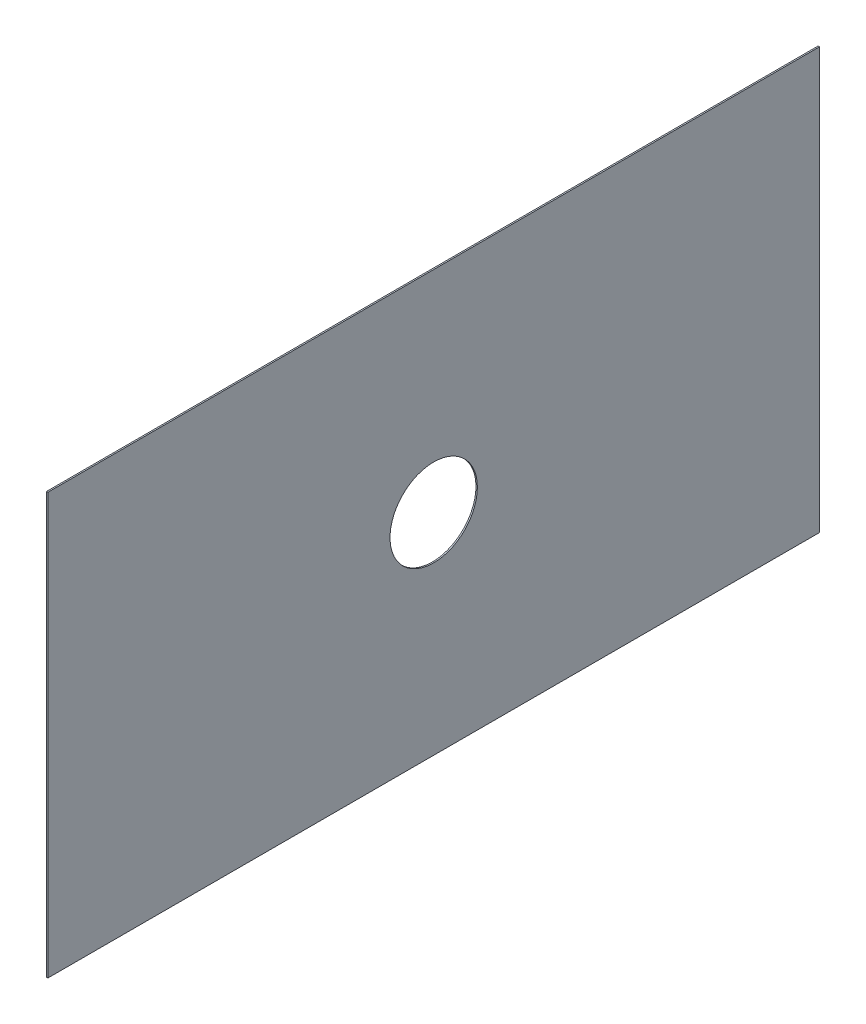
ISO-10303-21;
HEADER;
FILE_DESCRIPTION(('STEP AP214'),'2;1');
FILE_NAME('part.step','',(''),(''),'','','');
FILE_SCHEMA(('AUTOMOTIVE_DESIGN { 1 0 10303 214 1 1 1 1 }'));
ENDSEC;
DATA;
#1=APPLICATION_CONTEXT('core data for automotive mechanical design processes');
#2=APPLICATION_PROTOCOL_DEFINITION('international standard','automotive_design',2000,#1);
#3=PRODUCT_CONTEXT('',#1,'mechanical');
#4=PRODUCT('Part','Part','',(#3));
#5=PRODUCT_RELATED_PRODUCT_CATEGORY('part','',(#4));
#6=PRODUCT_DEFINITION_FORMATION('','',#4);
#7=PRODUCT_DEFINITION_CONTEXT('part definition',#1,'design');
#8=PRODUCT_DEFINITION('design','',#6,#7);
#9=PRODUCT_DEFINITION_SHAPE('','',#8);
#10=(LENGTH_UNIT() NAMED_UNIT(*) SI_UNIT(.MILLI.,.METRE.));
#11=(NAMED_UNIT(*) PLANE_ANGLE_UNIT() SI_UNIT($,.RADIAN.));
#12=(NAMED_UNIT(*) SI_UNIT($,.STERADIAN.) SOLID_ANGLE_UNIT());
#13=UNCERTAINTY_MEASURE_WITH_UNIT(LENGTH_MEASURE(1.E-05),#10,'distance_accuracy_value','');
#14=(GEOMETRIC_REPRESENTATION_CONTEXT(3) GLOBAL_UNCERTAINTY_ASSIGNED_CONTEXT((#13)) GLOBAL_UNIT_ASSIGNED_CONTEXT((#10,
#11,#12)) REPRESENTATION_CONTEXT('',''));
#15=CARTESIAN_POINT('',(0.,0.,0.));
#16=DIRECTION('',(0.,0.,1.));
#17=DIRECTION('',(1.,0.,0.));
#18=AXIS2_PLACEMENT_3D('',#15,#16,#17);
#19=CARTESIAN_POINT('',(2.,-301.,552.));
#20=DIRECTION('',(0.,0.,-1.));
#21=DIRECTION('',(-1.,0.,0.));
#22=AXIS2_PLACEMENT_3D('',#19,#20,#21);
#23=PLANE('',#22);
#24=DIRECTION('',(0.,-1.,0.));
#25=VECTOR('',#24,1.);
#26=CARTESIAN_POINT('',(0.,-301.,552.));
#27=LINE('',#26,#25);
#28=CARTESIAN_POINT('',(0.,301.,552.));
#29=VERTEX_POINT('',#28);
#30=CARTESIAN_POINT('',(0.,-301.,552.));
#31=VERTEX_POINT('',#30);
#32=EDGE_CURVE('E94',#29,#31,#27,.T.);
#33=ORIENTED_EDGE('',*,*,#32,.T.);
#34=DIRECTION('',(-1.,0.,0.));
#35=VECTOR('',#34,1.);
#36=CARTESIAN_POINT('',(2.,-301.,552.));
#37=LINE('',#36,#35);
#38=CARTESIAN_POINT('',(2.,-301.,552.));
#39=VERTEX_POINT('',#38);
#40=EDGE_CURVE('E11',#39,#31,#37,.T.);
#41=ORIENTED_EDGE('',*,*,#40,.F.);
#42=DIRECTION('',(0.,-1.,0.));
#43=VECTOR('',#42,1.);
#44=CARTESIAN_POINT('',(2.,-301.,552.));
#45=LINE('',#44,#43);
#46=CARTESIAN_POINT('',(2.,301.,552.));
#47=VERTEX_POINT('',#46);
#48=EDGE_CURVE('E82',#47,#39,#45,.T.);
#49=ORIENTED_EDGE('',*,*,#48,.F.);
#50=DIRECTION('',(-1.,0.,0.));
#51=VECTOR('',#50,1.);
#52=CARTESIAN_POINT('',(2.,301.,552.));
#53=LINE('',#52,#51);
#54=EDGE_CURVE('E90',#47,#29,#53,.T.);
#55=ORIENTED_EDGE('',*,*,#54,.T.);
#56=EDGE_LOOP('',(#33,#41,#49,#55));
#57=FACE_BOUND('',#56,.T.);
#58=ADVANCED_FACE('F31',(#57),#23,.F.);
#59=CARTESIAN_POINT('',(2.,-301.,-552.));
#60=DIRECTION('',(0.,1.,0.));
#61=DIRECTION('',(0.,0.,1.));
#62=AXIS2_PLACEMENT_3D('',#59,#60,#61);
#63=PLANE('',#62);
#64=DIRECTION('',(0.,0.,-1.));
#65=VECTOR('',#64,1.);
#66=CARTESIAN_POINT('',(0.,-301.,-552.));
#67=LINE('',#66,#65);
#68=CARTESIAN_POINT('',(0.,-301.,-552.));
#69=VERTEX_POINT('',#68);
#70=EDGE_CURVE('E86',#31,#69,#67,.T.);
#71=ORIENTED_EDGE('',*,*,#70,.T.);
#72=DIRECTION('',(-1.,0.,0.));
#73=VECTOR('',#72,1.);
#74=CARTESIAN_POINT('',(2.,-301.,-552.));
#75=LINE('',#74,#73);
#76=CARTESIAN_POINT('',(2.,-301.,-552.));
#77=VERTEX_POINT('',#76);
#78=EDGE_CURVE('E39',#77,#69,#75,.T.);
#79=ORIENTED_EDGE('',*,*,#78,.F.);
#80=DIRECTION('',(0.,0.,-1.));
#81=VECTOR('',#80,1.);
#82=CARTESIAN_POINT('',(2.,-301.,-552.));
#83=LINE('',#82,#81);
#84=EDGE_CURVE('E77',#39,#77,#83,.T.);
#85=ORIENTED_EDGE('',*,*,#84,.F.);
#86=ORIENTED_EDGE('',*,*,#40,.T.);
#87=EDGE_LOOP('',(#71,#79,#85,#86));
#88=FACE_BOUND('',#87,.T.);
#89=ADVANCED_FACE('F85',(#88),#63,.F.);
#90=CARTESIAN_POINT('',(2.,-301.,-552.));
#91=DIRECTION('',(0.,0.,1.));
#92=DIRECTION('',(1.,0.,0.));
#93=AXIS2_PLACEMENT_3D('',#90,#91,#92);
#94=PLANE('',#93);
#95=DIRECTION('',(0.,1.,0.));
#96=VECTOR('',#95,1.);
#97=CARTESIAN_POINT('',(0.,-301.,-552.));
#98=LINE('',#97,#96);
#99=CARTESIAN_POINT('',(0.,301.,-552.));
#100=VERTEX_POINT('',#99);
#101=EDGE_CURVE('E64',#69,#100,#98,.T.);
#102=ORIENTED_EDGE('',*,*,#101,.T.);
#103=DIRECTION('',(-1.,0.,0.));
#104=VECTOR('',#103,1.);
#105=CARTESIAN_POINT('',(2.,301.,-552.));
#106=LINE('',#105,#104);
#107=CARTESIAN_POINT('',(2.,301.,-552.));
#108=VERTEX_POINT('',#107);
#109=EDGE_CURVE('E87',#108,#100,#106,.T.);
#110=ORIENTED_EDGE('',*,*,#109,.F.);
#111=DIRECTION('',(0.,1.,0.));
#112=VECTOR('',#111,1.);
#113=CARTESIAN_POINT('',(2.,-301.,-552.));
#114=LINE('',#113,#112);
#115=EDGE_CURVE('E80',#77,#108,#114,.T.);
#116=ORIENTED_EDGE('',*,*,#115,.F.);
#117=ORIENTED_EDGE('',*,*,#78,.T.);
#118=EDGE_LOOP('',(#102,#110,#116,#117));
#119=FACE_BOUND('',#118,.T.);
#120=ADVANCED_FACE('F88',(#119),#94,.F.);
#121=CARTESIAN_POINT('',(2.,301.,-552.));
#122=DIRECTION('',(0.,-1.,0.));
#123=DIRECTION('',(0.,0.,-1.));
#124=AXIS2_PLACEMENT_3D('',#121,#122,#123);
#125=PLANE('',#124);
#126=DIRECTION('',(0.,0.,1.));
#127=VECTOR('',#126,1.);
#128=CARTESIAN_POINT('',(0.,301.,-552.));
#129=LINE('',#128,#127);
#130=EDGE_CURVE('E70',#100,#29,#129,.T.);
#131=ORIENTED_EDGE('',*,*,#130,.T.);
#132=ORIENTED_EDGE('',*,*,#54,.F.);
#133=DIRECTION('',(0.,0.,1.));
#134=VECTOR('',#133,1.);
#135=CARTESIAN_POINT('',(2.,301.,-552.));
#136=LINE('',#135,#134);
#137=EDGE_CURVE('E47',#108,#47,#136,.T.);
#138=ORIENTED_EDGE('',*,*,#137,.F.);
#139=ORIENTED_EDGE('',*,*,#109,.T.);
#140=EDGE_LOOP('',(#131,#132,#138,#139));
#141=FACE_BOUND('',#140,.T.);
#142=ADVANCED_FACE('F102',(#141),#125,.F.);
#143=CARTESIAN_POINT('',(2.,301.,552.));
#144=DIRECTION('',(1.,0.,0.));
#145=DIRECTION('',(0.,0.,-1.));
#146=AXIS2_PLACEMENT_3D('',#143,#144,#145);
#147=PLANE('',#146);
#148=CARTESIAN_POINT('',(2.,0.,0.));
#149=DIRECTION('',(1.,0.,0.));
#150=DIRECTION('',(0.,0.,-1.));
#151=AXIS2_PLACEMENT_3D('',#148,#149,#150);
#152=CIRCLE('',#151,62.5);
#153=CARTESIAN_POINT('',(2.,0.,-62.5));
#154=VERTEX_POINT('',#153);
#155=EDGE_CURVE('E108',#154,#154,#152,.T.);
#156=ORIENTED_EDGE('',*,*,#155,.F.);
#157=EDGE_LOOP('',(#156));
#158=FACE_BOUND('',#157,.T.);
#159=ORIENTED_EDGE('',*,*,#48,.T.);
#160=ORIENTED_EDGE('',*,*,#84,.T.);
#161=ORIENTED_EDGE('',*,*,#115,.T.);
#162=ORIENTED_EDGE('',*,*,#137,.T.);
#163=EDGE_LOOP('',(#159,#160,#161,#162));
#164=FACE_BOUND('',#163,.T.);
#165=ADVANCED_FACE('F78',(#158,#164),#147,.T.);
#166=CARTESIAN_POINT('',(0.,301.,552.));
#167=DIRECTION('',(1.,0.,0.));
#168=DIRECTION('',(0.,0.,-1.));
#169=AXIS2_PLACEMENT_3D('',#166,#167,#168);
#170=PLANE('',#169);
#171=CARTESIAN_POINT('',(0.,0.,0.));
#172=DIRECTION('',(1.,0.,0.));
#173=DIRECTION('',(0.,0.,-1.));
#174=AXIS2_PLACEMENT_3D('',#171,#172,#173);
#175=CIRCLE('',#174,62.5);
#176=CARTESIAN_POINT('',(0.,0.,-62.5));
#177=VERTEX_POINT('',#176);
#178=EDGE_CURVE('E97',#177,#177,#175,.T.);
#179=ORIENTED_EDGE('',*,*,#178,.T.);
#180=EDGE_LOOP('',(#179));
#181=FACE_BOUND('',#180,.T.);
#182=ORIENTED_EDGE('',*,*,#32,.F.);
#183=ORIENTED_EDGE('',*,*,#130,.F.);
#184=ORIENTED_EDGE('',*,*,#101,.F.);
#185=ORIENTED_EDGE('',*,*,#70,.F.);
#186=EDGE_LOOP('',(#182,#183,#184,#185));
#187=FACE_BOUND('',#186,.T.);
#188=ADVANCED_FACE('F105',(#181,#187),#170,.F.);
#189=CARTESIAN_POINT('',(0.,0.,0.));
#190=DIRECTION('',(1.,0.,0.));
#191=DIRECTION('',(0.,0.,-1.));
#192=AXIS2_PLACEMENT_3D('',#189,#190,#191);
#193=CYLINDRICAL_SURFACE('',#192,62.5);
#194=ORIENTED_EDGE('',*,*,#178,.F.);
#195=EDGE_LOOP('',(#194));
#196=FACE_BOUND('',#195,.T.);
#197=ORIENTED_EDGE('',*,*,#155,.T.);
#198=EDGE_LOOP('',(#197));
#199=FACE_BOUND('',#198,.T.);
#200=ADVANCED_FACE('F115',(#196,#199),#193,.F.);
#201=CLOSED_SHELL('',(#58,#89,#120,#142,#165,#188,#200));
#202=MANIFOLD_SOLID_BREP('B2',#201);
#203=ADVANCED_BREP_SHAPE_REPRESENTATION('',(#18,#202),#14);
#204=SHAPE_DEFINITION_REPRESENTATION(#9,#203);
ENDSEC;
END-ISO-10303-21;
